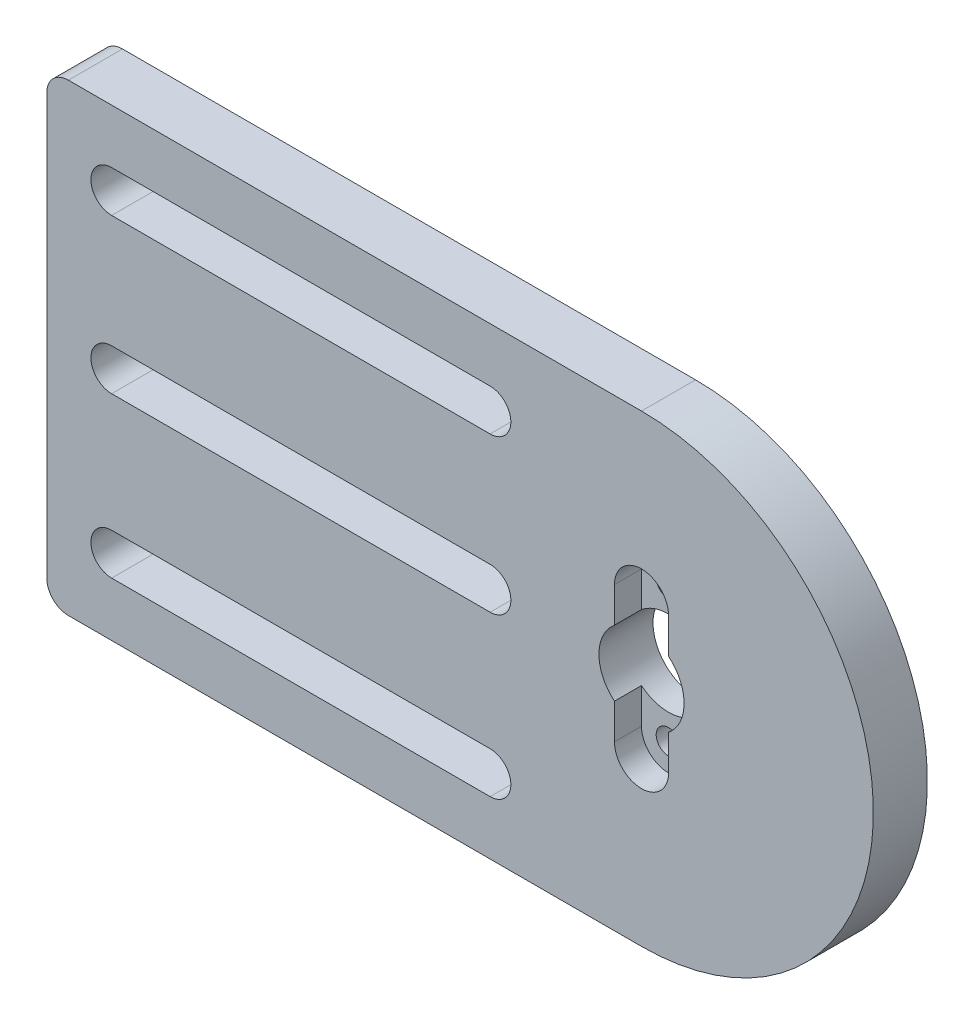
ISO-10303-21;
HEADER;
FILE_DESCRIPTION(('STEP AP214'),'2;1');
FILE_NAME('part.step','',(''),(''),'','','');
FILE_SCHEMA(('AUTOMOTIVE_DESIGN { 1 0 10303 214 1 1 1 1 }'));
ENDSEC;
DATA;
#1=APPLICATION_CONTEXT('core data for automotive mechanical design processes');
#2=APPLICATION_PROTOCOL_DEFINITION('international standard','automotive_design',2000,#1);
#3=PRODUCT_CONTEXT('',#1,'mechanical');
#4=PRODUCT('Part','Part','',(#3));
#5=PRODUCT_RELATED_PRODUCT_CATEGORY('part','',(#4));
#6=PRODUCT_DEFINITION_FORMATION('','',#4);
#7=PRODUCT_DEFINITION_CONTEXT('part definition',#1,'design');
#8=PRODUCT_DEFINITION('design','',#6,#7);
#9=PRODUCT_DEFINITION_SHAPE('','',#8);
#10=(LENGTH_UNIT() NAMED_UNIT(*) SI_UNIT(.MILLI.,.METRE.));
#11=(NAMED_UNIT(*) PLANE_ANGLE_UNIT() SI_UNIT($,.RADIAN.));
#12=(NAMED_UNIT(*) SI_UNIT($,.STERADIAN.) SOLID_ANGLE_UNIT());
#13=UNCERTAINTY_MEASURE_WITH_UNIT(LENGTH_MEASURE(1.E-05),#10,'distance_accuracy_value','');
#14=(GEOMETRIC_REPRESENTATION_CONTEXT(3) GLOBAL_UNCERTAINTY_ASSIGNED_CONTEXT((#13)) GLOBAL_UNIT_ASSIGNED_CONTEXT((#10,
#11,#12)) REPRESENTATION_CONTEXT('',''));
#15=CARTESIAN_POINT('',(0.,0.,0.));
#16=DIRECTION('',(0.,0.,1.));
#17=DIRECTION('',(1.,0.,0.));
#18=AXIS2_PLACEMENT_3D('',#15,#16,#17);
#19=CARTESIAN_POINT('',(65.3529750460943,7.60097780543942,6.35));
#20=DIRECTION('',(0.,0.,-1.));
#21=DIRECTION('',(-1.,0.,0.));
#22=AXIS2_PLACEMENT_3D('',#19,#20,#21);
#23=CYLINDRICAL_SURFACE('',#22,1.45000000000002);
#24=CARTESIAN_POINT('',(65.3529750460943,7.60097780543942,0.));
#25=DIRECTION('',(0.,0.,1.));
#26=DIRECTION('',(1.,0.,0.));
#27=AXIS2_PLACEMENT_3D('',#24,#25,#26);
#28=CIRCLE('',#27,1.45000000000002);
#29=CARTESIAN_POINT('',(66.8029750460943,7.60097780543942,0.));
#30=VERTEX_POINT('',#29);
#31=EDGE_CURVE('E364',#30,#30,#28,.T.);
#32=ORIENTED_EDGE('',*,*,#31,.F.);
#33=EDGE_LOOP('',(#32));
#34=FACE_BOUND('',#33,.T.);
#35=CARTESIAN_POINT('',(65.3529750460943,7.60097780543942,3.175));
#36=DIRECTION('',(0.,0.,1.));
#37=DIRECTION('',(1.,0.,0.));
#38=AXIS2_PLACEMENT_3D('',#35,#36,#37);
#39=CIRCLE('',#38,1.45000000000002);
#40=CARTESIAN_POINT('',(66.8029750460943,7.60097780543942,3.175));
#41=VERTEX_POINT('',#40);
#42=EDGE_CURVE('E262',#41,#41,#39,.T.);
#43=ORIENTED_EDGE('',*,*,#42,.T.);
#44=EDGE_LOOP('',(#43));
#45=FACE_BOUND('',#44,.T.);
#46=ADVANCED_FACE('F46',(#34,#45),#23,.F.);
#47=CARTESIAN_POINT('',(65.3529750460943,-8.39902219456058,6.35));
#48=DIRECTION('',(0.,0.,-1.));
#49=DIRECTION('',(-1.,0.,0.));
#50=AXIS2_PLACEMENT_3D('',#47,#48,#49);
#51=CYLINDRICAL_SURFACE('',#50,1.45);
#52=CARTESIAN_POINT('',(65.3529750460943,-8.39902219456058,0.));
#53=DIRECTION('',(0.,0.,1.));
#54=DIRECTION('',(1.,0.,0.));
#55=AXIS2_PLACEMENT_3D('',#52,#53,#54);
#56=CIRCLE('',#55,1.45);
#57=CARTESIAN_POINT('',(66.8029750460943,-8.39902219456058,0.));
#58=VERTEX_POINT('',#57);
#59=EDGE_CURVE('E361',#58,#58,#56,.T.);
#60=ORIENTED_EDGE('',*,*,#59,.F.);
#61=EDGE_LOOP('',(#60));
#62=FACE_BOUND('',#61,.T.);
#63=CARTESIAN_POINT('',(65.3529750460943,-8.39902219456058,3.175));
#64=DIRECTION('',(0.,0.,1.));
#65=DIRECTION('',(1.,0.,0.));
#66=AXIS2_PLACEMENT_3D('',#63,#64,#65);
#67=CIRCLE('',#66,1.45);
#68=CARTESIAN_POINT('',(66.8029750460943,-8.39902219456058,3.175));
#69=VERTEX_POINT('',#68);
#70=EDGE_CURVE('E257',#69,#69,#67,.T.);
#71=ORIENTED_EDGE('',*,*,#70,.T.);
#72=EDGE_LOOP('',(#71));
#73=FACE_BOUND('',#72,.T.);
#74=ADVANCED_FACE('F468',(#62,#73),#51,.F.);
#75=CARTESIAN_POINT('',(-1.95702495390572,24.2889162058389,6.35));
#76=DIRECTION('',(0.,0.,1.));
#77=DIRECTION('',(1.,0.,0.));
#78=AXIS2_PLACEMENT_3D('',#75,#76,#77);
#79=CYLINDRICAL_SURFACE('',#78,2.54);
#80=DIRECTION('',(0.,0.,1.));
#81=VECTOR('',#80,1.);
#82=CARTESIAN_POINT('',(-1.95702495390572,26.8289162058389,6.35));
#83=LINE('',#82,#81);
#84=CARTESIAN_POINT('',(-1.95702495390573,26.8289162058389,0.));
#85=VERTEX_POINT('',#84);
#86=CARTESIAN_POINT('',(-1.95702495390573,26.8289162058389,6.35));
#87=VERTEX_POINT('',#86);
#88=EDGE_CURVE('E411',#85,#87,#83,.T.);
#89=ORIENTED_EDGE('',*,*,#88,.F.);
#90=CARTESIAN_POINT('',(-1.95702495390572,24.2889162058389,0.));
#91=DIRECTION('',(0.,0.,1.));
#92=DIRECTION('',(1.,0.,0.));
#93=AXIS2_PLACEMENT_3D('',#90,#91,#92);
#94=CIRCLE('',#93,2.54);
#95=CARTESIAN_POINT('',(-4.49702495390572,24.2889162058389,0.));
#96=VERTEX_POINT('',#95);
#97=EDGE_CURVE('E417',#96,#85,#94,.F.);
#98=ORIENTED_EDGE('',*,*,#97,.F.);
#99=DIRECTION('',(0.,0.,1.));
#100=VECTOR('',#99,1.);
#101=CARTESIAN_POINT('',(-4.49702495390572,24.2889162058389,6.35));
#102=LINE('',#101,#100);
#103=CARTESIAN_POINT('',(-4.49702495390572,24.2889162058389,6.35));
#104=VERTEX_POINT('',#103);
#105=EDGE_CURVE('E414',#104,#96,#102,.F.);
#106=ORIENTED_EDGE('',*,*,#105,.F.);
#107=CARTESIAN_POINT('',(-1.95702495390572,24.2889162058389,6.35));
#108=DIRECTION('',(0.,0.,1.));
#109=DIRECTION('',(1.,0.,0.));
#110=AXIS2_PLACEMENT_3D('',#107,#108,#109);
#111=CIRCLE('',#110,2.54);
#112=EDGE_CURVE('E419',#87,#104,#111,.T.);
#113=ORIENTED_EDGE('',*,*,#112,.F.);
#114=EDGE_LOOP('',(#89,#98,#106,#113));
#115=FACE_BOUND('',#114,.T.);
#116=ADVANCED_FACE('F48',(#115),#79,.T.);
#117=CARTESIAN_POINT('',(-1.95702495390572,-25.0869605949601,6.35));
#118=DIRECTION('',(0.,0.,-1.));
#119=DIRECTION('',(-1.,0.,0.));
#120=AXIS2_PLACEMENT_3D('',#117,#118,#119);
#121=CYLINDRICAL_SURFACE('',#120,2.54);
#122=DIRECTION('',(0.,0.,-1.));
#123=VECTOR('',#122,1.);
#124=CARTESIAN_POINT('',(-1.95702495390572,-27.6269605949601,6.35));
#125=LINE('',#124,#123);
#126=CARTESIAN_POINT('',(-1.95702495390573,-27.6269605949601,6.35));
#127=VERTEX_POINT('',#126);
#128=CARTESIAN_POINT('',(-1.95702495390573,-27.6269605949601,0.));
#129=VERTEX_POINT('',#128);
#130=EDGE_CURVE('E400',#127,#129,#125,.T.);
#131=ORIENTED_EDGE('',*,*,#130,.F.);
#132=CARTESIAN_POINT('',(-1.95702495390572,-25.0869605949601,6.35));
#133=DIRECTION('',(0.,0.,1.));
#134=DIRECTION('',(1.,0.,0.));
#135=AXIS2_PLACEMENT_3D('',#132,#133,#134);
#136=CIRCLE('',#135,2.54);
#137=CARTESIAN_POINT('',(-4.49702495390572,-25.0869605949601,6.35));
#138=VERTEX_POINT('',#137);
#139=EDGE_CURVE('E406',#138,#127,#136,.T.);
#140=ORIENTED_EDGE('',*,*,#139,.F.);
#141=DIRECTION('',(0.,0.,-1.));
#142=VECTOR('',#141,1.);
#143=CARTESIAN_POINT('',(-4.49702495390572,-25.0869605949601,6.35));
#144=LINE('',#143,#142);
#145=CARTESIAN_POINT('',(-4.49702495390572,-25.0869605949601,0.));
#146=VERTEX_POINT('',#145);
#147=EDGE_CURVE('E403',#146,#138,#144,.F.);
#148=ORIENTED_EDGE('',*,*,#147,.F.);
#149=CARTESIAN_POINT('',(-1.95702495390572,-25.0869605949601,0.));
#150=DIRECTION('',(0.,0.,1.));
#151=DIRECTION('',(1.,0.,0.));
#152=AXIS2_PLACEMENT_3D('',#149,#150,#151);
#153=CIRCLE('',#152,2.54);
#154=EDGE_CURVE('E408',#129,#146,#153,.F.);
#155=ORIENTED_EDGE('',*,*,#154,.F.);
#156=EDGE_LOOP('',(#131,#140,#148,#155));
#157=FACE_BOUND('',#156,.T.);
#158=ADVANCED_FACE('F487',(#157),#121,.T.);
#159=CARTESIAN_POINT('',(65.3529750460943,-0.399022194560578,6.35));
#160=DIRECTION('',(0.,0.,1.));
#161=DIRECTION('',(1.,0.,0.));
#162=AXIS2_PLACEMENT_3D('',#159,#160,#161);
#163=PLANE('',#162);
#164=DIRECTION('',(0.,-1.,0.));
#165=VECTOR('',#164,1.);
#166=CARTESIAN_POINT('',(62.1779750460943,7.60097780543942,6.35));
#167=LINE('',#166,#165);
#168=CARTESIAN_POINT('',(62.1779750460943,-4.26158287369559,6.35));
#169=VERTEX_POINT('',#168);
#170=CARTESIAN_POINT('',(62.1779750460943,-8.39902219456058,6.35));
#171=VERTEX_POINT('',#170);
#172=EDGE_CURVE('E243',#169,#171,#167,.T.);
#173=ORIENTED_EDGE('',*,*,#172,.F.);
#174=CARTESIAN_POINT('',(65.3529750460943,-0.399022194560578,6.35));
#175=DIRECTION('',(0.,0.,1.));
#176=DIRECTION('',(1.,0.,0.));
#177=AXIS2_PLACEMENT_3D('',#174,#175,#176);
#178=CIRCLE('',#177,4.99999999999999);
#179=CARTESIAN_POINT('',(62.1779750460943,3.46353848457443,6.35));
#180=VERTEX_POINT('',#179);
#181=EDGE_CURVE('E371',#180,#169,#178,.T.);
#182=ORIENTED_EDGE('',*,*,#181,.F.);
#183=CARTESIAN_POINT('',(62.1779750460943,7.60097780543942,6.35));
#184=VERTEX_POINT('',#183);
#185=EDGE_CURVE('E241',#184,#180,#167,.T.);
#186=ORIENTED_EDGE('',*,*,#185,.F.);
#187=CARTESIAN_POINT('',(65.3529750460943,7.60097780543942,6.35));
#188=DIRECTION('',(0.,0.,1.));
#189=DIRECTION('',(1.,0.,0.));
#190=AXIS2_PLACEMENT_3D('',#187,#188,#189);
#191=CIRCLE('',#190,3.175);
#192=CARTESIAN_POINT('',(68.5279750460943,7.60097780543942,6.35));
#193=VERTEX_POINT('',#192);
#194=EDGE_CURVE('E252',#193,#184,#191,.T.);
#195=ORIENTED_EDGE('',*,*,#194,.F.);
#196=DIRECTION('',(0.,1.,0.));
#197=VECTOR('',#196,1.);
#198=CARTESIAN_POINT('',(68.5279750460943,7.60097780543942,6.35));
#199=LINE('',#198,#197);
#200=CARTESIAN_POINT('',(68.5279750460943,3.46353848457443,6.35));
#201=VERTEX_POINT('',#200);
#202=EDGE_CURVE('E249',#201,#193,#199,.T.);
#203=ORIENTED_EDGE('',*,*,#202,.F.);
#204=CARTESIAN_POINT('',(68.5279750460943,-4.26158287369559,6.35));
#205=VERTEX_POINT('',#204);
#206=EDGE_CURVE('E368',#205,#201,#178,.T.);
#207=ORIENTED_EDGE('',*,*,#206,.F.);
#208=CARTESIAN_POINT('',(68.5279750460943,-8.39902219456058,6.35));
#209=VERTEX_POINT('',#208);
#210=EDGE_CURVE('E250',#209,#205,#199,.T.);
#211=ORIENTED_EDGE('',*,*,#210,.F.);
#212=CARTESIAN_POINT('',(65.3529750460943,-8.39902219456058,6.35));
#213=DIRECTION('',(0.,0.,1.));
#214=DIRECTION('',(1.,0.,0.));
#215=AXIS2_PLACEMENT_3D('',#212,#213,#214);
#216=CIRCLE('',#215,3.175);
#217=EDGE_CURVE('E225',#171,#209,#216,.T.);
#218=ORIENTED_EDGE('',*,*,#217,.F.);
#219=EDGE_LOOP('',(#173,#182,#186,#195,#203,#207,#211,#218));
#220=FACE_BOUND('',#219,.T.);
#221=DIRECTION('',(-1.,0.,0.));
#222=VECTOR('',#221,1.);
#223=CARTESIAN_POINT('',(65.3529750460943,26.8289162058389,6.35));
#224=LINE('',#223,#222);
#225=CARTESIAN_POINT('',(65.3529750460943,26.8289162058389,6.35));
#226=VERTEX_POINT('',#225);
#227=EDGE_CURVE('E377',#226,#87,#224,.T.);
#228=ORIENTED_EDGE('',*,*,#227,.T.);
#229=ORIENTED_EDGE('',*,*,#112,.T.);
#230=DIRECTION('',(0.,-1.,0.));
#231=VECTOR('',#230,1.);
#232=CARTESIAN_POINT('',(-4.49702495390572,-27.6269605949601,6.35));
#233=LINE('',#232,#231);
#234=EDGE_CURVE('E381',#104,#138,#233,.T.);
#235=ORIENTED_EDGE('',*,*,#234,.T.);
#236=ORIENTED_EDGE('',*,*,#139,.T.);
#237=DIRECTION('',(1.,0.,0.));
#238=VECTOR('',#237,1.);
#239=CARTESIAN_POINT('',(65.3529750460943,-27.6269605949601,6.35));
#240=LINE('',#239,#238);
#241=CARTESIAN_POINT('',(65.3529750460943,-27.6269605949601,6.35));
#242=VERTEX_POINT('',#241);
#243=EDGE_CURVE('E383',#127,#242,#240,.T.);
#244=ORIENTED_EDGE('',*,*,#243,.T.);
#245=CARTESIAN_POINT('',(65.3529750460943,-0.399022194560578,6.35));
#246=DIRECTION('',(0.,0.,1.));
#247=DIRECTION('',(1.,0.,0.));
#248=AXIS2_PLACEMENT_3D('',#245,#246,#247);
#249=CIRCLE('',#248,27.2279384003995);
#250=EDGE_CURVE('E374',#242,#226,#249,.T.);
#251=ORIENTED_EDGE('',*,*,#250,.T.);
#252=EDGE_LOOP('',(#228,#229,#235,#236,#244,#251));
#253=FACE_BOUND('',#252,.T.);
#254=DIRECTION('',(-1.,0.,0.));
#255=VECTOR('',#254,1.);
#256=CARTESIAN_POINT('',(47.5729750460943,20.4789162058389,6.35));
#257=LINE('',#256,#255);
#258=CARTESIAN_POINT('',(47.5729750460943,20.4789162058389,6.35));
#259=VERTEX_POINT('',#258);
#260=CARTESIAN_POINT('',(3.12297504609427,20.4789162058389,6.35));
#261=VERTEX_POINT('',#260);
#262=EDGE_CURVE('E333',#259,#261,#257,.T.);
#263=ORIENTED_EDGE('',*,*,#262,.F.);
#264=CARTESIAN_POINT('',(47.5729750460943,18.0439162058389,6.35));
#265=DIRECTION('',(0.,0.,1.));
#266=DIRECTION('',(1.,0.,0.));
#267=AXIS2_PLACEMENT_3D('',#264,#265,#266);
#268=CIRCLE('',#267,2.435);
#269=CARTESIAN_POINT('',(47.5729750460943,15.6089162058389,6.35));
#270=VERTEX_POINT('',#269);
#271=EDGE_CURVE('E331',#270,#259,#268,.T.);
#272=ORIENTED_EDGE('',*,*,#271,.F.);
#273=DIRECTION('',(1.,0.,0.));
#274=VECTOR('',#273,1.);
#275=CARTESIAN_POINT('',(47.5729750460943,15.6089162058389,6.35));
#276=LINE('',#275,#274);
#277=CARTESIAN_POINT('',(3.12297504609427,15.6089162058389,6.35));
#278=VERTEX_POINT('',#277);
#279=EDGE_CURVE('E339',#278,#270,#276,.T.);
#280=ORIENTED_EDGE('',*,*,#279,.F.);
#281=CARTESIAN_POINT('',(3.12297504609427,18.0439162058389,6.35));
#282=DIRECTION('',(0.,0.,1.));
#283=DIRECTION('',(1.,0.,0.));
#284=AXIS2_PLACEMENT_3D('',#281,#282,#283);
#285=CIRCLE('',#284,2.435);
#286=EDGE_CURVE('E336',#261,#278,#285,.T.);
#287=ORIENTED_EDGE('',*,*,#286,.F.);
#288=EDGE_LOOP('',(#263,#272,#280,#287));
#289=FACE_BOUND('',#288,.T.);
#290=DIRECTION('',(1.,0.,0.));
#291=VECTOR('',#290,1.);
#292=CARTESIAN_POINT('',(3.12297504609427,-2.52121279916454,6.35));
#293=LINE('',#292,#291);
#294=CARTESIAN_POINT('',(3.12297504609427,-2.52121279916454,6.35));
#295=VERTEX_POINT('',#294);
#296=CARTESIAN_POINT('',(47.5729750460943,-2.52121279916454,6.35));
#297=VERTEX_POINT('',#296);
#298=EDGE_CURVE('E302',#295,#297,#293,.T.);
#299=ORIENTED_EDGE('',*,*,#298,.F.);
#300=CARTESIAN_POINT('',(3.12297504609427,-0.0862127991645424,6.35));
#301=DIRECTION('',(0.,0.,1.));
#302=DIRECTION('',(1.,0.,0.));
#303=AXIS2_PLACEMENT_3D('',#300,#301,#302);
#304=CIRCLE('',#303,2.435);
#305=CARTESIAN_POINT('',(3.12297504609427,2.34878720083546,6.35));
#306=VERTEX_POINT('',#305);
#307=EDGE_CURVE('E300',#306,#295,#304,.T.);
#308=ORIENTED_EDGE('',*,*,#307,.F.);
#309=DIRECTION('',(-1.,0.,0.));
#310=VECTOR('',#309,1.);
#311=CARTESIAN_POINT('',(3.12297504609427,2.34878720083546,6.35));
#312=LINE('',#311,#310);
#313=CARTESIAN_POINT('',(47.5729750460943,2.34878720083546,6.35));
#314=VERTEX_POINT('',#313);
#315=EDGE_CURVE('E308',#314,#306,#312,.T.);
#316=ORIENTED_EDGE('',*,*,#315,.F.);
#317=CARTESIAN_POINT('',(47.5729750460943,-0.0862127991645424,6.35));
#318=DIRECTION('',(0.,0.,1.));
#319=DIRECTION('',(1.,0.,0.));
#320=AXIS2_PLACEMENT_3D('',#317,#318,#319);
#321=CIRCLE('',#320,2.435);
#322=EDGE_CURVE('E305',#297,#314,#321,.T.);
#323=ORIENTED_EDGE('',*,*,#322,.F.);
#324=EDGE_LOOP('',(#299,#308,#316,#323));
#325=FACE_BOUND('',#324,.T.);
#326=DIRECTION('',(1.,0.,0.));
#327=VECTOR('',#326,1.);
#328=CARTESIAN_POINT('',(3.12297504609427,-21.2769605949601,6.35));
#329=LINE('',#328,#327);
#330=CARTESIAN_POINT('',(3.12297504609427,-21.2769605949601,6.35));
#331=VERTEX_POINT('',#330);
#332=CARTESIAN_POINT('',(47.5729750460943,-21.2769605949601,6.35));
#333=VERTEX_POINT('',#332);
#334=EDGE_CURVE('E270',#331,#333,#329,.T.);
#335=ORIENTED_EDGE('',*,*,#334,.F.);
#336=CARTESIAN_POINT('',(3.12297504609427,-18.8419605949601,6.35));
#337=DIRECTION('',(0.,0.,1.));
#338=DIRECTION('',(1.,0.,0.));
#339=AXIS2_PLACEMENT_3D('',#336,#337,#338);
#340=CIRCLE('',#339,2.435);
#341=CARTESIAN_POINT('',(3.12297504609427,-16.4069605949601,6.35));
#342=VERTEX_POINT('',#341);
#343=EDGE_CURVE('E268',#342,#331,#340,.T.);
#344=ORIENTED_EDGE('',*,*,#343,.F.);
#345=DIRECTION('',(-1.,0.,0.));
#346=VECTOR('',#345,1.);
#347=CARTESIAN_POINT('',(3.12297504609427,-16.4069605949601,6.35));
#348=LINE('',#347,#346);
#349=CARTESIAN_POINT('',(47.5729750460943,-16.4069605949601,6.35));
#350=VERTEX_POINT('',#349);
#351=EDGE_CURVE('E276',#350,#342,#348,.T.);
#352=ORIENTED_EDGE('',*,*,#351,.F.);
#353=CARTESIAN_POINT('',(47.5729750460943,-18.8419605949601,6.35));
#354=DIRECTION('',(0.,0.,1.));
#355=DIRECTION('',(1.,0.,0.));
#356=AXIS2_PLACEMENT_3D('',#353,#354,#355);
#357=CIRCLE('',#356,2.435);
#358=EDGE_CURVE('E273',#333,#350,#357,.T.);
#359=ORIENTED_EDGE('',*,*,#358,.F.);
#360=EDGE_LOOP('',(#335,#344,#352,#359));
#361=FACE_BOUND('',#360,.T.);
#362=ADVANCED_FACE('F437',(#220,#253,#289,#325,#361),#163,.T.);
#363=CARTESIAN_POINT('',(65.3529750460943,-0.399022194560578,0.));
#364=DIRECTION('',(0.,0.,1.));
#365=DIRECTION('',(1.,0.,0.));
#366=AXIS2_PLACEMENT_3D('',#363,#364,#365);
#367=PLANE('',#366);
#368=CARTESIAN_POINT('',(3.12297504609427,-0.0862127991645424,0.));
#369=DIRECTION('',(0.,0.,1.));
#370=DIRECTION('',(1.,0.,0.));
#371=AXIS2_PLACEMENT_3D('',#368,#369,#370);
#372=CIRCLE('',#371,2.435);
#373=CARTESIAN_POINT('',(3.12297504609427,2.34878720083546,0.));
#374=VERTEX_POINT('',#373);
#375=CARTESIAN_POINT('',(3.12297504609427,-2.52121279916454,0.));
#376=VERTEX_POINT('',#375);
#377=EDGE_CURVE('E299',#374,#376,#372,.T.);
#378=ORIENTED_EDGE('',*,*,#377,.T.);
#379=DIRECTION('',(1.,0.,0.));
#380=VECTOR('',#379,1.);
#381=CARTESIAN_POINT('',(3.12297504609427,-2.52121279916454,0.));
#382=LINE('',#381,#380);
#383=CARTESIAN_POINT('',(47.5729750460943,-2.52121279916454,0.));
#384=VERTEX_POINT('',#383);
#385=EDGE_CURVE('E313',#376,#384,#382,.T.);
#386=ORIENTED_EDGE('',*,*,#385,.T.);
#387=CARTESIAN_POINT('',(47.5729750460943,-0.0862127991645424,0.));
#388=DIRECTION('',(0.,0.,1.));
#389=DIRECTION('',(1.,0.,0.));
#390=AXIS2_PLACEMENT_3D('',#387,#388,#389);
#391=CIRCLE('',#390,2.435);
#392=CARTESIAN_POINT('',(47.5729750460943,2.34878720083546,0.));
#393=VERTEX_POINT('',#392);
#394=EDGE_CURVE('E316',#384,#393,#391,.T.);
#395=ORIENTED_EDGE('',*,*,#394,.T.);
#396=DIRECTION('',(-1.,0.,0.));
#397=VECTOR('',#396,1.);
#398=CARTESIAN_POINT('',(3.12297504609427,2.34878720083546,0.));
#399=LINE('',#398,#397);
#400=EDGE_CURVE('E303',#393,#374,#399,.T.);
#401=ORIENTED_EDGE('',*,*,#400,.T.);
#402=EDGE_LOOP('',(#378,#386,#395,#401));
#403=FACE_BOUND('',#402,.T.);
#404=ORIENTED_EDGE('',*,*,#59,.T.);
#405=EDGE_LOOP('',(#404));
#406=FACE_BOUND('',#405,.T.);
#407=ORIENTED_EDGE('',*,*,#31,.T.);
#408=EDGE_LOOP('',(#407));
#409=FACE_BOUND('',#408,.T.);
#410=CARTESIAN_POINT('',(65.3529750460943,-0.399022194560578,0.));
#411=DIRECTION('',(0.,0.,1.));
#412=DIRECTION('',(1.,0.,0.));
#413=AXIS2_PLACEMENT_3D('',#410,#411,#412);
#414=CIRCLE('',#413,4.99999999999999);
#415=CARTESIAN_POINT('',(70.3529750460943,-0.399022194560578,0.));
#416=VERTEX_POINT('',#415);
#417=EDGE_CURVE('E367',#416,#416,#414,.T.);
#418=ORIENTED_EDGE('',*,*,#417,.T.);
#419=EDGE_LOOP('',(#418));
#420=FACE_BOUND('',#419,.T.);
#421=DIRECTION('',(0.,-1.,0.));
#422=VECTOR('',#421,1.);
#423=CARTESIAN_POINT('',(-4.49702495390572,-27.6269605949601,0.));
#424=LINE('',#423,#422);
#425=EDGE_CURVE('E392',#96,#146,#424,.T.);
#426=ORIENTED_EDGE('',*,*,#425,.F.);
#427=ORIENTED_EDGE('',*,*,#97,.T.);
#428=DIRECTION('',(-1.,0.,0.));
#429=VECTOR('',#428,1.);
#430=CARTESIAN_POINT('',(65.3529750460943,26.8289162058389,0.));
#431=LINE('',#430,#429);
#432=CARTESIAN_POINT('',(65.3529750460943,26.8289162058389,0.));
#433=VERTEX_POINT('',#432);
#434=EDGE_CURVE('E389',#433,#85,#431,.T.);
#435=ORIENTED_EDGE('',*,*,#434,.F.);
#436=CARTESIAN_POINT('',(65.3529750460943,-0.399022194560578,0.));
#437=DIRECTION('',(0.,0.,1.));
#438=DIRECTION('',(1.,0.,0.));
#439=AXIS2_PLACEMENT_3D('',#436,#437,#438);
#440=CIRCLE('',#439,27.2279384003995);
#441=CARTESIAN_POINT('',(65.3529750460943,-27.6269605949601,0.));
#442=VERTEX_POINT('',#441);
#443=EDGE_CURVE('E386',#442,#433,#440,.T.);
#444=ORIENTED_EDGE('',*,*,#443,.F.);
#445=DIRECTION('',(1.,0.,0.));
#446=VECTOR('',#445,1.);
#447=CARTESIAN_POINT('',(65.3529750460943,-27.6269605949601,0.));
#448=LINE('',#447,#446);
#449=EDGE_CURVE('E378',#129,#442,#448,.T.);
#450=ORIENTED_EDGE('',*,*,#449,.F.);
#451=ORIENTED_EDGE('',*,*,#154,.T.);
#452=EDGE_LOOP('',(#426,#427,#435,#444,#450,#451));
#453=FACE_BOUND('',#452,.T.);
#454=CARTESIAN_POINT('',(47.5729750460943,18.0439162058389,0.));
#455=DIRECTION('',(0.,0.,1.));
#456=DIRECTION('',(1.,0.,0.));
#457=AXIS2_PLACEMENT_3D('',#454,#455,#456);
#458=CIRCLE('',#457,2.435);
#459=CARTESIAN_POINT('',(47.5729750460943,15.6089162058389,0.));
#460=VERTEX_POINT('',#459);
#461=CARTESIAN_POINT('',(47.5729750460943,20.4789162058389,0.));
#462=VERTEX_POINT('',#461);
#463=EDGE_CURVE('E330',#460,#462,#458,.T.);
#464=ORIENTED_EDGE('',*,*,#463,.T.);
#465=DIRECTION('',(-1.,0.,0.));
#466=VECTOR('',#465,1.);
#467=CARTESIAN_POINT('',(47.5729750460943,20.4789162058389,0.));
#468=LINE('',#467,#466);
#469=CARTESIAN_POINT('',(3.12297504609427,20.4789162058389,0.));
#470=VERTEX_POINT('',#469);
#471=EDGE_CURVE('E344',#462,#470,#468,.T.);
#472=ORIENTED_EDGE('',*,*,#471,.T.);
#473=CARTESIAN_POINT('',(3.12297504609427,18.0439162058389,0.));
#474=DIRECTION('',(0.,0.,1.));
#475=DIRECTION('',(1.,0.,0.));
#476=AXIS2_PLACEMENT_3D('',#473,#474,#475);
#477=CIRCLE('',#476,2.435);
#478=CARTESIAN_POINT('',(3.12297504609427,15.6089162058389,0.));
#479=VERTEX_POINT('',#478);
#480=EDGE_CURVE('E347',#470,#479,#477,.T.);
#481=ORIENTED_EDGE('',*,*,#480,.T.);
#482=DIRECTION('',(1.,0.,0.));
#483=VECTOR('',#482,1.);
#484=CARTESIAN_POINT('',(47.5729750460943,15.6089162058389,0.));
#485=LINE('',#484,#483);
#486=EDGE_CURVE('E334',#479,#460,#485,.T.);
#487=ORIENTED_EDGE('',*,*,#486,.T.);
#488=EDGE_LOOP('',(#464,#472,#481,#487));
#489=FACE_BOUND('',#488,.T.);
#490=CARTESIAN_POINT('',(3.12297504609427,-18.8419605949601,0.));
#491=DIRECTION('',(0.,0.,1.));
#492=DIRECTION('',(1.,0.,0.));
#493=AXIS2_PLACEMENT_3D('',#490,#491,#492);
#494=CIRCLE('',#493,2.435);
#495=CARTESIAN_POINT('',(3.12297504609427,-16.4069605949601,0.));
#496=VERTEX_POINT('',#495);
#497=CARTESIAN_POINT('',(3.12297504609427,-21.2769605949601,0.));
#498=VERTEX_POINT('',#497);
#499=EDGE_CURVE('E279',#496,#498,#494,.T.);
#500=ORIENTED_EDGE('',*,*,#499,.T.);
#501=DIRECTION('',(1.,0.,0.));
#502=VECTOR('',#501,1.);
#503=CARTESIAN_POINT('',(3.12297504609427,-21.2769605949601,0.));
#504=LINE('',#503,#502);
#505=CARTESIAN_POINT('',(47.5729750460943,-21.2769605949601,0.));
#506=VERTEX_POINT('',#505);
#507=EDGE_CURVE('E282',#498,#506,#504,.T.);
#508=ORIENTED_EDGE('',*,*,#507,.T.);
#509=CARTESIAN_POINT('',(47.5729750460943,-18.8419605949601,0.));
#510=DIRECTION('',(0.,0.,1.));
#511=DIRECTION('',(1.,0.,0.));
#512=AXIS2_PLACEMENT_3D('',#509,#510,#511);
#513=CIRCLE('',#512,2.435);
#514=CARTESIAN_POINT('',(47.5729750460943,-16.4069605949601,0.));
#515=VERTEX_POINT('',#514);
#516=EDGE_CURVE('E285',#506,#515,#513,.T.);
#517=ORIENTED_EDGE('',*,*,#516,.T.);
#518=DIRECTION('',(-1.,0.,0.));
#519=VECTOR('',#518,1.);
#520=CARTESIAN_POINT('',(3.12297504609427,-16.4069605949601,0.));
#521=LINE('',#520,#519);
#522=EDGE_CURVE('E271',#515,#496,#521,.T.);
#523=ORIENTED_EDGE('',*,*,#522,.T.);
#524=EDGE_LOOP('',(#500,#508,#517,#523));
#525=FACE_BOUND('',#524,.T.);
#526=ADVANCED_FACE('F486',(#403,#406,#409,#420,#453,#489,#525),#367,.F.);
#527=CARTESIAN_POINT('',(65.3529750460943,-0.399022194560578,6.35));
#528=DIRECTION('',(0.,0.,-1.));
#529=DIRECTION('',(-1.,0.,0.));
#530=AXIS2_PLACEMENT_3D('',#527,#528,#529);
#531=CYLINDRICAL_SURFACE('',#530,27.2279384003995);
#532=ORIENTED_EDGE('',*,*,#443,.T.);
#533=DIRECTION('',(0.,0.,-1.));
#534=VECTOR('',#533,1.);
#535=CARTESIAN_POINT('',(65.3529750460943,26.8289162058389,6.35));
#536=LINE('',#535,#534);
#537=EDGE_CURVE('E397',#226,#433,#536,.T.);
#538=ORIENTED_EDGE('',*,*,#537,.F.);
#539=ORIENTED_EDGE('',*,*,#250,.F.);
#540=DIRECTION('',(0.,0.,-1.));
#541=VECTOR('',#540,1.);
#542=CARTESIAN_POINT('',(65.3529750460943,-27.6269605949601,6.35));
#543=LINE('',#542,#541);
#544=EDGE_CURVE('E385',#242,#442,#543,.T.);
#545=ORIENTED_EDGE('',*,*,#544,.T.);
#546=EDGE_LOOP('',(#532,#538,#539,#545));
#547=FACE_BOUND('',#546,.T.);
#548=ADVANCED_FACE('F490',(#547),#531,.T.);
#549=CARTESIAN_POINT('',(65.3529750460943,26.8289162058389,6.35));
#550=DIRECTION('',(0.,-1.,0.));
#551=DIRECTION('',(1.,0.,0.));
#552=AXIS2_PLACEMENT_3D('',#549,#550,#551);
#553=PLANE('',#552);
#554=ORIENTED_EDGE('',*,*,#434,.T.);
#555=ORIENTED_EDGE('',*,*,#88,.T.);
#556=ORIENTED_EDGE('',*,*,#227,.F.);
#557=ORIENTED_EDGE('',*,*,#537,.T.);
#558=EDGE_LOOP('',(#554,#555,#556,#557));
#559=FACE_BOUND('',#558,.T.);
#560=ADVANCED_FACE('F498',(#559),#553,.F.);
#561=CARTESIAN_POINT('',(-4.49702495390572,-27.6269605949601,6.35));
#562=DIRECTION('',(1.,0.,0.));
#563=DIRECTION('',(0.,0.,-1.));
#564=AXIS2_PLACEMENT_3D('',#561,#562,#563);
#565=PLANE('',#564);
#566=ORIENTED_EDGE('',*,*,#234,.F.);
#567=ORIENTED_EDGE('',*,*,#105,.T.);
#568=ORIENTED_EDGE('',*,*,#425,.T.);
#569=ORIENTED_EDGE('',*,*,#147,.T.);
#570=EDGE_LOOP('',(#566,#567,#568,#569));
#571=FACE_BOUND('',#570,.T.);
#572=ADVANCED_FACE('F494',(#571),#565,.F.);
#573=CARTESIAN_POINT('',(65.3529750460943,-27.6269605949601,6.35));
#574=DIRECTION('',(0.,1.,0.));
#575=DIRECTION('',(-1.,0.,0.));
#576=AXIS2_PLACEMENT_3D('',#573,#574,#575);
#577=PLANE('',#576);
#578=ORIENTED_EDGE('',*,*,#243,.F.);
#579=ORIENTED_EDGE('',*,*,#130,.T.);
#580=ORIENTED_EDGE('',*,*,#449,.T.);
#581=ORIENTED_EDGE('',*,*,#544,.F.);
#582=EDGE_LOOP('',(#578,#579,#580,#581));
#583=FACE_BOUND('',#582,.T.);
#584=ADVANCED_FACE('F483',(#583),#577,.F.);
#585=CARTESIAN_POINT('',(65.3529750460943,-0.399022194560578,6.35));
#586=DIRECTION('',(0.,0.,-1.));
#587=DIRECTION('',(-1.,0.,0.));
#588=AXIS2_PLACEMENT_3D('',#585,#586,#587);
#589=CYLINDRICAL_SURFACE('',#588,4.99999999999999);
#590=DIRECTION('',(0.,0.,-1.));
#591=VECTOR('',#590,1.);
#592=CARTESIAN_POINT('',(62.1779750460943,3.46353848457443,6.35));
#593=LINE('',#592,#591);
#594=CARTESIAN_POINT('',(62.1779750460943,3.46353848457443,3.175));
#595=VERTEX_POINT('',#594);
#596=EDGE_CURVE('E13',#180,#595,#593,.T.);
#597=ORIENTED_EDGE('',*,*,#596,.F.);
#598=ORIENTED_EDGE('',*,*,#181,.T.);
#599=DIRECTION('',(0.,0.,-1.));
#600=VECTOR('',#599,1.);
#601=CARTESIAN_POINT('',(62.1779750460943,-4.26158287369559,6.35));
#602=LINE('',#601,#600);
#603=CARTESIAN_POINT('',(62.1779750460943,-4.26158287369559,3.175));
#604=VERTEX_POINT('',#603);
#605=EDGE_CURVE('E424',#604,#169,#602,.F.);
#606=ORIENTED_EDGE('',*,*,#605,.F.);
#607=CARTESIAN_POINT('',(65.3529750460943,-0.399022194560578,3.175));
#608=DIRECTION('',(0.,0.,1.));
#609=DIRECTION('',(1.,0.,0.));
#610=AXIS2_PLACEMENT_3D('',#607,#608,#609);
#611=CIRCLE('',#610,4.99999999999999);
#612=CARTESIAN_POINT('',(68.5279750460943,-4.26158287369559,3.175));
#613=VERTEX_POINT('',#612);
#614=EDGE_CURVE('E265',#604,#613,#611,.T.);
#615=ORIENTED_EDGE('',*,*,#614,.T.);
#616=DIRECTION('',(0.,0.,-1.));
#617=VECTOR('',#616,1.);
#618=CARTESIAN_POINT('',(68.5279750460943,-4.26158287369559,6.35));
#619=LINE('',#618,#617);
#620=EDGE_CURVE('E232',#205,#613,#619,.T.);
#621=ORIENTED_EDGE('',*,*,#620,.F.);
#622=ORIENTED_EDGE('',*,*,#206,.T.);
#623=DIRECTION('',(0.,0.,-1.));
#624=VECTOR('',#623,1.);
#625=CARTESIAN_POINT('',(68.5279750460943,3.46353848457443,6.35));
#626=LINE('',#625,#624);
#627=CARTESIAN_POINT('',(68.5279750460943,3.46353848457443,3.175));
#628=VERTEX_POINT('',#627);
#629=EDGE_CURVE('E54',#628,#201,#626,.F.);
#630=ORIENTED_EDGE('',*,*,#629,.F.);
#631=EDGE_CURVE('E267',#628,#595,#611,.T.);
#632=ORIENTED_EDGE('',*,*,#631,.T.);
#633=EDGE_LOOP('',(#597,#598,#606,#615,#621,#622,#630,#632));
#634=FACE_BOUND('',#633,.T.);
#635=ORIENTED_EDGE('',*,*,#417,.F.);
#636=EDGE_LOOP('',(#635));
#637=FACE_BOUND('',#636,.T.);
#638=ADVANCED_FACE('F441',(#634,#637),#589,.F.);
#639=CARTESIAN_POINT('',(47.5729750460943,18.0439162058389,6.35));
#640=DIRECTION('',(0.,0.,-1.));
#641=DIRECTION('',(-1.,0.,0.));
#642=AXIS2_PLACEMENT_3D('',#639,#640,#641);
#643=CYLINDRICAL_SURFACE('',#642,2.435);
#644=ORIENTED_EDGE('',*,*,#463,.F.);
#645=DIRECTION('',(0.,0.,-1.));
#646=VECTOR('',#645,1.);
#647=CARTESIAN_POINT('',(47.5729750460943,15.6089162058389,6.35));
#648=LINE('',#647,#646);
#649=EDGE_CURVE('E341',#270,#460,#648,.T.);
#650=ORIENTED_EDGE('',*,*,#649,.F.);
#651=ORIENTED_EDGE('',*,*,#271,.T.);
#652=DIRECTION('',(0.,0.,-1.));
#653=VECTOR('',#652,1.);
#654=CARTESIAN_POINT('',(47.5729750460943,20.4789162058389,6.35));
#655=LINE('',#654,#653);
#656=EDGE_CURVE('E358',#259,#462,#655,.T.);
#657=ORIENTED_EDGE('',*,*,#656,.T.);
#658=EDGE_LOOP('',(#644,#650,#651,#657));
#659=FACE_BOUND('',#658,.T.);
#660=ADVANCED_FACE('F482',(#659),#643,.F.);
#661=CARTESIAN_POINT('',(47.5729750460943,20.4789162058389,6.35));
#662=DIRECTION('',(0.,-1.,0.));
#663=DIRECTION('',(1.,0.,0.));
#664=AXIS2_PLACEMENT_3D('',#661,#662,#663);
#665=PLANE('',#664);
#666=ORIENTED_EDGE('',*,*,#471,.F.);
#667=ORIENTED_EDGE('',*,*,#656,.F.);
#668=ORIENTED_EDGE('',*,*,#262,.T.);
#669=DIRECTION('',(0.,0.,-1.));
#670=VECTOR('',#669,1.);
#671=CARTESIAN_POINT('',(3.12297504609427,20.4789162058389,6.35));
#672=LINE('',#671,#670);
#673=EDGE_CURVE('E356',#261,#470,#672,.T.);
#674=ORIENTED_EDGE('',*,*,#673,.T.);
#675=EDGE_LOOP('',(#666,#667,#668,#674));
#676=FACE_BOUND('',#675,.T.);
#677=ADVANCED_FACE('F580',(#676),#665,.T.);
#678=CARTESIAN_POINT('',(3.12297504609427,18.0439162058389,6.35));
#679=DIRECTION('',(0.,0.,-1.));
#680=DIRECTION('',(-1.,0.,0.));
#681=AXIS2_PLACEMENT_3D('',#678,#679,#680);
#682=CYLINDRICAL_SURFACE('',#681,2.435);
#683=ORIENTED_EDGE('',*,*,#480,.F.);
#684=ORIENTED_EDGE('',*,*,#673,.F.);
#685=ORIENTED_EDGE('',*,*,#286,.T.);
#686=DIRECTION('',(0.,0.,-1.));
#687=VECTOR('',#686,1.);
#688=CARTESIAN_POINT('',(3.12297504609427,15.6089162058389,6.35));
#689=LINE('',#688,#687);
#690=EDGE_CURVE('E354',#278,#479,#689,.T.);
#691=ORIENTED_EDGE('',*,*,#690,.T.);
#692=EDGE_LOOP('',(#683,#684,#685,#691));
#693=FACE_BOUND('',#692,.T.);
#694=ADVANCED_FACE('F576',(#693),#682,.F.);
#695=CARTESIAN_POINT('',(47.5729750460943,15.6089162058389,6.35));
#696=DIRECTION('',(0.,1.,0.));
#697=DIRECTION('',(-1.,0.,0.));
#698=AXIS2_PLACEMENT_3D('',#695,#696,#697);
#699=PLANE('',#698);
#700=ORIENTED_EDGE('',*,*,#486,.F.);
#701=ORIENTED_EDGE('',*,*,#690,.F.);
#702=ORIENTED_EDGE('',*,*,#279,.T.);
#703=ORIENTED_EDGE('',*,*,#649,.T.);
#704=EDGE_LOOP('',(#700,#701,#702,#703));
#705=FACE_BOUND('',#704,.T.);
#706=ADVANCED_FACE('F572',(#705),#699,.T.);
#707=CARTESIAN_POINT('',(3.12297504609427,-0.0862127991645424,6.35));
#708=DIRECTION('',(0.,0.,-1.));
#709=DIRECTION('',(-1.,0.,0.));
#710=AXIS2_PLACEMENT_3D('',#707,#708,#709);
#711=CYLINDRICAL_SURFACE('',#710,2.435);
#712=ORIENTED_EDGE('',*,*,#377,.F.);
#713=DIRECTION('',(0.,0.,-1.));
#714=VECTOR('',#713,1.);
#715=CARTESIAN_POINT('',(3.12297504609427,2.34878720083546,6.35));
#716=LINE('',#715,#714);
#717=EDGE_CURVE('E310',#306,#374,#716,.T.);
#718=ORIENTED_EDGE('',*,*,#717,.F.);
#719=ORIENTED_EDGE('',*,*,#307,.T.);
#720=DIRECTION('',(0.,0.,-1.));
#721=VECTOR('',#720,1.);
#722=CARTESIAN_POINT('',(3.12297504609427,-2.52121279916454,6.35));
#723=LINE('',#722,#721);
#724=EDGE_CURVE('E327',#295,#376,#723,.T.);
#725=ORIENTED_EDGE('',*,*,#724,.T.);
#726=EDGE_LOOP('',(#712,#718,#719,#725));
#727=FACE_BOUND('',#726,.T.);
#728=ADVANCED_FACE('F568',(#727),#711,.F.);
#729=CARTESIAN_POINT('',(3.12297504609427,-2.52121279916454,6.35));
#730=DIRECTION('',(0.,1.,0.));
#731=DIRECTION('',(0.,0.,1.));
#732=AXIS2_PLACEMENT_3D('',#729,#730,#731);
#733=PLANE('',#732);
#734=ORIENTED_EDGE('',*,*,#385,.F.);
#735=ORIENTED_EDGE('',*,*,#724,.F.);
#736=ORIENTED_EDGE('',*,*,#298,.T.);
#737=DIRECTION('',(0.,0.,-1.));
#738=VECTOR('',#737,1.);
#739=CARTESIAN_POINT('',(47.5729750460943,-2.52121279916454,6.35));
#740=LINE('',#739,#738);
#741=EDGE_CURVE('E325',#297,#384,#740,.T.);
#742=ORIENTED_EDGE('',*,*,#741,.T.);
#743=EDGE_LOOP('',(#734,#735,#736,#742));
#744=FACE_BOUND('',#743,.T.);
#745=ADVANCED_FACE('F564',(#744),#733,.T.);
#746=CARTESIAN_POINT('',(47.5729750460943,-0.0862127991645424,6.35));
#747=DIRECTION('',(0.,0.,-1.));
#748=DIRECTION('',(-1.,0.,0.));
#749=AXIS2_PLACEMENT_3D('',#746,#747,#748);
#750=CYLINDRICAL_SURFACE('',#749,2.435);
#751=ORIENTED_EDGE('',*,*,#394,.F.);
#752=ORIENTED_EDGE('',*,*,#741,.F.);
#753=ORIENTED_EDGE('',*,*,#322,.T.);
#754=DIRECTION('',(0.,0.,-1.));
#755=VECTOR('',#754,1.);
#756=CARTESIAN_POINT('',(47.5729750460943,2.34878720083546,6.35));
#757=LINE('',#756,#755);
#758=EDGE_CURVE('E323',#314,#393,#757,.T.);
#759=ORIENTED_EDGE('',*,*,#758,.T.);
#760=EDGE_LOOP('',(#751,#752,#753,#759));
#761=FACE_BOUND('',#760,.T.);
#762=ADVANCED_FACE('F560',(#761),#750,.F.);
#763=CARTESIAN_POINT('',(3.12297504609427,2.34878720083546,6.35));
#764=DIRECTION('',(0.,-1.,0.));
#765=DIRECTION('',(0.,0.,-1.));
#766=AXIS2_PLACEMENT_3D('',#763,#764,#765);
#767=PLANE('',#766);
#768=ORIENTED_EDGE('',*,*,#400,.F.);
#769=ORIENTED_EDGE('',*,*,#758,.F.);
#770=ORIENTED_EDGE('',*,*,#315,.T.);
#771=ORIENTED_EDGE('',*,*,#717,.T.);
#772=EDGE_LOOP('',(#768,#769,#770,#771));
#773=FACE_BOUND('',#772,.T.);
#774=ADVANCED_FACE('F557',(#773),#767,.T.);
#775=CARTESIAN_POINT('',(3.12297504609427,-18.8419605949601,6.35));
#776=DIRECTION('',(0.,0.,-1.));
#777=DIRECTION('',(-1.,0.,0.));
#778=AXIS2_PLACEMENT_3D('',#775,#776,#777);
#779=CYLINDRICAL_SURFACE('',#778,2.435);
#780=ORIENTED_EDGE('',*,*,#499,.F.);
#781=DIRECTION('',(0.,0.,-1.));
#782=VECTOR('',#781,1.);
#783=CARTESIAN_POINT('',(3.12297504609427,-16.4069605949601,6.35));
#784=LINE('',#783,#782);
#785=EDGE_CURVE('E278',#342,#496,#784,.T.);
#786=ORIENTED_EDGE('',*,*,#785,.F.);
#787=ORIENTED_EDGE('',*,*,#343,.T.);
#788=DIRECTION('',(0.,0.,-1.));
#789=VECTOR('',#788,1.);
#790=CARTESIAN_POINT('',(3.12297504609427,-21.2769605949601,6.35));
#791=LINE('',#790,#789);
#792=EDGE_CURVE('E296',#331,#498,#791,.T.);
#793=ORIENTED_EDGE('',*,*,#792,.T.);
#794=EDGE_LOOP('',(#780,#786,#787,#793));
#795=FACE_BOUND('',#794,.T.);
#796=ADVANCED_FACE('F531',(#795),#779,.F.);
#797=CARTESIAN_POINT('',(3.12297504609427,-21.2769605949601,6.35));
#798=DIRECTION('',(0.,1.,0.));
#799=DIRECTION('',(-1.,0.,0.));
#800=AXIS2_PLACEMENT_3D('',#797,#798,#799);
#801=PLANE('',#800);
#802=ORIENTED_EDGE('',*,*,#507,.F.);
#803=ORIENTED_EDGE('',*,*,#792,.F.);
#804=ORIENTED_EDGE('',*,*,#334,.T.);
#805=DIRECTION('',(0.,0.,-1.));
#806=VECTOR('',#805,1.);
#807=CARTESIAN_POINT('',(47.5729750460943,-21.2769605949601,6.35));
#808=LINE('',#807,#806);
#809=EDGE_CURVE('E294',#333,#506,#808,.T.);
#810=ORIENTED_EDGE('',*,*,#809,.T.);
#811=EDGE_LOOP('',(#802,#803,#804,#810));
#812=FACE_BOUND('',#811,.T.);
#813=ADVANCED_FACE('F540',(#812),#801,.T.);
#814=CARTESIAN_POINT('',(47.5729750460943,-18.8419605949601,6.35));
#815=DIRECTION('',(0.,0.,-1.));
#816=DIRECTION('',(-1.,0.,0.));
#817=AXIS2_PLACEMENT_3D('',#814,#815,#816);
#818=CYLINDRICAL_SURFACE('',#817,2.435);
#819=ORIENTED_EDGE('',*,*,#516,.F.);
#820=ORIENTED_EDGE('',*,*,#809,.F.);
#821=ORIENTED_EDGE('',*,*,#358,.T.);
#822=DIRECTION('',(0.,0.,-1.));
#823=VECTOR('',#822,1.);
#824=CARTESIAN_POINT('',(47.5729750460943,-16.4069605949601,6.35));
#825=LINE('',#824,#823);
#826=EDGE_CURVE('E292',#350,#515,#825,.T.);
#827=ORIENTED_EDGE('',*,*,#826,.T.);
#828=EDGE_LOOP('',(#819,#820,#821,#827));
#829=FACE_BOUND('',#828,.T.);
#830=ADVANCED_FACE('F544',(#829),#818,.F.);
#831=CARTESIAN_POINT('',(3.12297504609427,-16.4069605949601,6.35));
#832=DIRECTION('',(0.,-1.,0.));
#833=DIRECTION('',(1.,0.,0.));
#834=AXIS2_PLACEMENT_3D('',#831,#832,#833);
#835=PLANE('',#834);
#836=ORIENTED_EDGE('',*,*,#522,.F.);
#837=ORIENTED_EDGE('',*,*,#826,.F.);
#838=ORIENTED_EDGE('',*,*,#351,.T.);
#839=ORIENTED_EDGE('',*,*,#785,.T.);
#840=EDGE_LOOP('',(#836,#837,#838,#839));
#841=FACE_BOUND('',#840,.T.);
#842=ADVANCED_FACE('F465',(#841),#835,.T.);
#843=CARTESIAN_POINT('',(65.3529750460943,-8.39902219456058,3.175));
#844=DIRECTION('',(0.,0.,1.));
#845=DIRECTION('',(1.,0.,0.));
#846=AXIS2_PLACEMENT_3D('',#843,#844,#845);
#847=PLANE('',#846);
#848=ORIENTED_EDGE('',*,*,#70,.F.);
#849=EDGE_LOOP('',(#848));
#850=FACE_BOUND('',#849,.T.);
#851=DIRECTION('',(0.,-1.,0.));
#852=VECTOR('',#851,1.);
#853=CARTESIAN_POINT('',(62.1779750460943,7.60097780543942,3.175));
#854=LINE('',#853,#852);
#855=CARTESIAN_POINT('',(62.1779750460943,-8.39902219456058,3.175));
#856=VERTEX_POINT('',#855);
#857=EDGE_CURVE('E239',#604,#856,#854,.T.);
#858=ORIENTED_EDGE('',*,*,#857,.T.);
#859=CARTESIAN_POINT('',(65.3529750460943,-8.39902219456058,3.175));
#860=DIRECTION('',(0.,0.,1.));
#861=DIRECTION('',(1.,0.,0.));
#862=AXIS2_PLACEMENT_3D('',#859,#860,#861);
#863=CIRCLE('',#862,3.175);
#864=CARTESIAN_POINT('',(68.5279750460943,-8.39902219456058,3.175));
#865=VERTEX_POINT('',#864);
#866=EDGE_CURVE('E223',#856,#865,#863,.T.);
#867=ORIENTED_EDGE('',*,*,#866,.T.);
#868=DIRECTION('',(0.,1.,0.));
#869=VECTOR('',#868,1.);
#870=CARTESIAN_POINT('',(68.5279750460943,7.60097780543942,3.175));
#871=LINE('',#870,#869);
#872=EDGE_CURVE('E68',#865,#613,#871,.T.);
#873=ORIENTED_EDGE('',*,*,#872,.T.);
#874=ORIENTED_EDGE('',*,*,#614,.F.);
#875=EDGE_LOOP('',(#858,#867,#873,#874));
#876=FACE_BOUND('',#875,.T.);
#877=ADVANCED_FACE('F237',(#850,#876),#847,.T.);
#878=CARTESIAN_POINT('',(68.5279750460943,7.60097780543942,3.175));
#879=DIRECTION('',(1.,0.,0.));
#880=DIRECTION('',(0.,0.,-1.));
#881=AXIS2_PLACEMENT_3D('',#878,#879,#880);
#882=PLANE('',#881);
#883=ORIENTED_EDGE('',*,*,#620,.T.);
#884=ORIENTED_EDGE('',*,*,#872,.F.);
#885=DIRECTION('',(0.,0.,1.));
#886=VECTOR('',#885,1.);
#887=CARTESIAN_POINT('',(68.5279750460943,-8.39902219456058,3.175));
#888=LINE('',#887,#886);
#889=EDGE_CURVE('E220',#865,#209,#888,.T.);
#890=ORIENTED_EDGE('',*,*,#889,.T.);
#891=ORIENTED_EDGE('',*,*,#210,.T.);
#892=EDGE_LOOP('',(#883,#884,#890,#891));
#893=FACE_BOUND('',#892,.T.);
#894=ADVANCED_FACE('F230',(#893),#882,.F.);
#895=CARTESIAN_POINT('',(62.1779750460943,7.60097780543942,3.175));
#896=DIRECTION('',(-1.,0.,0.));
#897=DIRECTION('',(0.,0.,1.));
#898=AXIS2_PLACEMENT_3D('',#895,#896,#897);
#899=PLANE('',#898);
#900=ORIENTED_EDGE('',*,*,#605,.T.);
#901=ORIENTED_EDGE('',*,*,#172,.T.);
#902=DIRECTION('',(0.,0.,1.));
#903=VECTOR('',#902,1.);
#904=CARTESIAN_POINT('',(62.1779750460943,-8.39902219456058,3.175));
#905=LINE('',#904,#903);
#906=EDGE_CURVE('E255',#856,#171,#905,.T.);
#907=ORIENTED_EDGE('',*,*,#906,.F.);
#908=ORIENTED_EDGE('',*,*,#857,.F.);
#909=EDGE_LOOP('',(#900,#901,#907,#908));
#910=FACE_BOUND('',#909,.T.);
#911=ADVANCED_FACE('F446',(#910),#899,.F.);
#912=CARTESIAN_POINT('',(65.3529750460943,-8.39902219456058,3.175));
#913=DIRECTION('',(0.,0.,1.));
#914=DIRECTION('',(1.,0.,0.));
#915=AXIS2_PLACEMENT_3D('',#912,#913,#914);
#916=CYLINDRICAL_SURFACE('',#915,3.175);
#917=ORIENTED_EDGE('',*,*,#217,.T.);
#918=ORIENTED_EDGE('',*,*,#889,.F.);
#919=ORIENTED_EDGE('',*,*,#866,.F.);
#920=ORIENTED_EDGE('',*,*,#906,.T.);
#921=EDGE_LOOP('',(#917,#918,#919,#920));
#922=FACE_BOUND('',#921,.T.);
#923=ADVANCED_FACE('F221',(#922),#916,.F.);
#924=ORIENTED_EDGE('',*,*,#596,.T.);
#925=CARTESIAN_POINT('',(62.1779750460943,7.60097780543942,3.175));
#926=VERTEX_POINT('',#925);
#927=EDGE_CURVE('E61',#926,#595,#854,.T.);
#928=ORIENTED_EDGE('',*,*,#927,.F.);
#929=DIRECTION('',(0.,0.,1.));
#930=VECTOR('',#929,1.);
#931=CARTESIAN_POINT('',(62.1779750460943,7.60097780543942,3.175));
#932=LINE('',#931,#930);
#933=EDGE_CURVE('E258',#926,#184,#932,.T.);
#934=ORIENTED_EDGE('',*,*,#933,.T.);
#935=ORIENTED_EDGE('',*,*,#185,.T.);
#936=EDGE_LOOP('',(#924,#928,#934,#935));
#937=FACE_BOUND('',#936,.T.);
#938=ADVANCED_FACE('F449',(#937),#899,.F.);
#939=ORIENTED_EDGE('',*,*,#42,.F.);
#940=EDGE_LOOP('',(#939));
#941=FACE_BOUND('',#940,.T.);
#942=CARTESIAN_POINT('',(68.5279750460943,7.60097780543942,3.175));
#943=VERTEX_POINT('',#942);
#944=EDGE_CURVE('E235',#628,#943,#871,.T.);
#945=ORIENTED_EDGE('',*,*,#944,.T.);
#946=CARTESIAN_POINT('',(65.3529750460943,7.60097780543942,3.175));
#947=DIRECTION('',(0.,0.,1.));
#948=DIRECTION('',(1.,0.,0.));
#949=AXIS2_PLACEMENT_3D('',#946,#947,#948);
#950=CIRCLE('',#949,3.175);
#951=EDGE_CURVE('E234',#943,#926,#950,.T.);
#952=ORIENTED_EDGE('',*,*,#951,.T.);
#953=ORIENTED_EDGE('',*,*,#927,.T.);
#954=ORIENTED_EDGE('',*,*,#631,.F.);
#955=EDGE_LOOP('',(#945,#952,#953,#954));
#956=FACE_BOUND('',#955,.T.);
#957=ADVANCED_FACE('F453',(#941,#956),#847,.T.);
#958=CARTESIAN_POINT('',(65.3529750460943,7.60097780543942,3.175));
#959=DIRECTION('',(0.,0.,1.));
#960=DIRECTION('',(1.,0.,0.));
#961=AXIS2_PLACEMENT_3D('',#958,#959,#960);
#962=CYLINDRICAL_SURFACE('',#961,3.175);
#963=ORIENTED_EDGE('',*,*,#194,.T.);
#964=ORIENTED_EDGE('',*,*,#933,.F.);
#965=ORIENTED_EDGE('',*,*,#951,.F.);
#966=DIRECTION('',(0.,0.,1.));
#967=VECTOR('',#966,1.);
#968=CARTESIAN_POINT('',(68.5279750460943,7.60097780543942,3.175));
#969=LINE('',#968,#967);
#970=EDGE_CURVE('E228',#943,#193,#969,.T.);
#971=ORIENTED_EDGE('',*,*,#970,.T.);
#972=EDGE_LOOP('',(#963,#964,#965,#971));
#973=FACE_BOUND('',#972,.T.);
#974=ADVANCED_FACE('F452',(#973),#962,.F.);
#975=ORIENTED_EDGE('',*,*,#629,.T.);
#976=ORIENTED_EDGE('',*,*,#202,.T.);
#977=ORIENTED_EDGE('',*,*,#970,.F.);
#978=ORIENTED_EDGE('',*,*,#944,.F.);
#979=EDGE_LOOP('',(#975,#976,#977,#978));
#980=FACE_BOUND('',#979,.T.);
#981=ADVANCED_FACE('F429',(#980),#882,.F.);
#982=CLOSED_SHELL('',(#46,#74,#116,#158,#362,#526,#548,#560,#572,#584,#638,#660,#677,#694,#706,
#728,#745,#762,#774,#796,#813,#830,#842,#877,#894,#911,#923,#938,#957,#974,#981));
#983=MANIFOLD_SOLID_BREP('B2',#982);
#984=ADVANCED_BREP_SHAPE_REPRESENTATION('',(#18,#983),#14);
#985=SHAPE_DEFINITION_REPRESENTATION(#9,#984);
ENDSEC;
END-ISO-10303-21;
